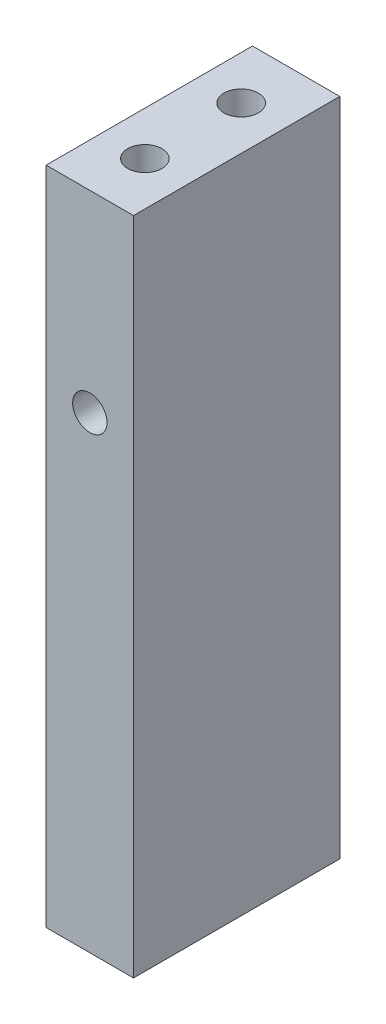
ISO-10303-21;
HEADER;
FILE_DESCRIPTION(('STEP AP214'),'2;1');
FILE_NAME('part.step','',(''),(''),'','','');
FILE_SCHEMA(('AUTOMOTIVE_DESIGN { 1 0 10303 214 1 1 1 1 }'));
ENDSEC;
DATA;
#1=APPLICATION_CONTEXT('core data for automotive mechanical design processes');
#2=APPLICATION_PROTOCOL_DEFINITION('international standard','automotive_design',2000,#1);
#3=PRODUCT_CONTEXT('',#1,'mechanical');
#4=PRODUCT('Part','Part','',(#3));
#5=PRODUCT_RELATED_PRODUCT_CATEGORY('part','',(#4));
#6=PRODUCT_DEFINITION_FORMATION('','',#4);
#7=PRODUCT_DEFINITION_CONTEXT('part definition',#1,'design');
#8=PRODUCT_DEFINITION('design','',#6,#7);
#9=PRODUCT_DEFINITION_SHAPE('','',#8);
#10=(LENGTH_UNIT() NAMED_UNIT(*) SI_UNIT(.MILLI.,.METRE.));
#11=(NAMED_UNIT(*) PLANE_ANGLE_UNIT() SI_UNIT($,.RADIAN.));
#12=(NAMED_UNIT(*) SI_UNIT($,.STERADIAN.) SOLID_ANGLE_UNIT());
#13=UNCERTAINTY_MEASURE_WITH_UNIT(LENGTH_MEASURE(1.E-05),#10,'distance_accuracy_value','');
#14=(GEOMETRIC_REPRESENTATION_CONTEXT(3) GLOBAL_UNCERTAINTY_ASSIGNED_CONTEXT((#13)) GLOBAL_UNIT_ASSIGNED_CONTEXT((#10,
#11,#12)) REPRESENTATION_CONTEXT('',''));
#15=CARTESIAN_POINT('',(0.,0.,0.));
#16=DIRECTION('',(0.,0.,1.));
#17=DIRECTION('',(1.,0.,0.));
#18=AXIS2_PLACEMENT_3D('',#15,#16,#17);
#19=CARTESIAN_POINT('',(0.,0.,15.));
#20=DIRECTION('',(1.,0.,0.));
#21=DIRECTION('',(0.,0.,-1.));
#22=AXIS2_PLACEMENT_3D('',#19,#20,#21);
#23=PLANE('',#22);
#24=DIRECTION('',(0.,-1.,0.));
#25=VECTOR('',#24,1.);
#26=CARTESIAN_POINT('',(0.,0.,0.));
#27=LINE('',#26,#25);
#28=CARTESIAN_POINT('',(0.,48.,0.));
#29=VERTEX_POINT('',#28);
#30=CARTESIAN_POINT('',(0.,0.,0.));
#31=VERTEX_POINT('',#30);
#32=EDGE_CURVE('E145',#29,#31,#27,.T.);
#33=ORIENTED_EDGE('',*,*,#32,.T.);
#34=DIRECTION('',(0.,0.,-1.));
#35=VECTOR('',#34,1.);
#36=CARTESIAN_POINT('',(0.,0.,15.));
#37=LINE('',#36,#35);
#38=CARTESIAN_POINT('',(0.,0.,15.));
#39=VERTEX_POINT('',#38);
#40=EDGE_CURVE('E11',#39,#31,#37,.T.);
#41=ORIENTED_EDGE('',*,*,#40,.F.);
#42=DIRECTION('',(0.,-1.,0.));
#43=VECTOR('',#42,1.);
#44=CARTESIAN_POINT('',(0.,0.,15.));
#45=LINE('',#44,#43);
#46=CARTESIAN_POINT('',(0.,48.,15.));
#47=VERTEX_POINT('',#46);
#48=EDGE_CURVE('E146',#47,#39,#45,.T.);
#49=ORIENTED_EDGE('',*,*,#48,.F.);
#50=DIRECTION('',(0.,0.,-1.));
#51=VECTOR('',#50,1.);
#52=CARTESIAN_POINT('',(0.,48.,15.));
#53=LINE('',#52,#51);
#54=EDGE_CURVE('E152',#47,#29,#53,.T.);
#55=ORIENTED_EDGE('',*,*,#54,.T.);
#56=EDGE_LOOP('',(#33,#41,#49,#55));
#57=FACE_BOUND('',#56,.T.);
#58=ADVANCED_FACE('F43',(#57),#23,.F.);
#59=CARTESIAN_POINT('',(0.,0.,15.));
#60=DIRECTION('',(0.,1.,0.));
#61=DIRECTION('',(0.,0.,1.));
#62=AXIS2_PLACEMENT_3D('',#59,#60,#61);
#63=PLANE('',#62);
#64=CARTESIAN_POINT('',(3.175,0.,11.));
#65=DIRECTION('',(0.,-1.,0.));
#66=DIRECTION('',(0.,0.,-1.));
#67=AXIS2_PLACEMENT_3D('',#64,#65,#66);
#68=CIRCLE('',#67,1.25);
#69=CARTESIAN_POINT('',(3.175,0.,9.75));
#70=VERTEX_POINT('',#69);
#71=EDGE_CURVE('E133',#70,#70,#68,.T.);
#72=ORIENTED_EDGE('',*,*,#71,.F.);
#73=EDGE_LOOP('',(#72));
#74=FACE_BOUND('',#73,.T.);
#75=CARTESIAN_POINT('',(3.175,0.,4.));
#76=DIRECTION('',(0.,-1.,0.));
#77=DIRECTION('',(0.,0.,-1.));
#78=AXIS2_PLACEMENT_3D('',#75,#76,#77);
#79=CIRCLE('',#78,1.25);
#80=CARTESIAN_POINT('',(3.175,0.,2.75));
#81=VERTEX_POINT('',#80);
#82=EDGE_CURVE('E139',#81,#81,#79,.T.);
#83=ORIENTED_EDGE('',*,*,#82,.F.);
#84=EDGE_LOOP('',(#83));
#85=FACE_BOUND('',#84,.T.);
#86=DIRECTION('',(1.,0.,0.));
#87=VECTOR('',#86,1.);
#88=CARTESIAN_POINT('',(0.,0.,0.));
#89=LINE('',#88,#87);
#90=CARTESIAN_POINT('',(6.35,0.,0.));
#91=VERTEX_POINT('',#90);
#92=EDGE_CURVE('E155',#31,#91,#89,.T.);
#93=ORIENTED_EDGE('',*,*,#92,.T.);
#94=DIRECTION('',(0.,0.,-1.));
#95=VECTOR('',#94,1.);
#96=CARTESIAN_POINT('',(6.35,0.,15.));
#97=LINE('',#96,#95);
#98=CARTESIAN_POINT('',(6.35,0.,15.));
#99=VERTEX_POINT('',#98);
#100=EDGE_CURVE('E51',#99,#91,#97,.T.);
#101=ORIENTED_EDGE('',*,*,#100,.F.);
#102=DIRECTION('',(1.,0.,0.));
#103=VECTOR('',#102,1.);
#104=CARTESIAN_POINT('',(0.,0.,15.));
#105=LINE('',#104,#103);
#106=EDGE_CURVE('E90',#39,#99,#105,.T.);
#107=ORIENTED_EDGE('',*,*,#106,.F.);
#108=ORIENTED_EDGE('',*,*,#40,.T.);
#109=EDGE_LOOP('',(#93,#101,#107,#108));
#110=FACE_BOUND('',#109,.T.);
#111=ADVANCED_FACE('F180',(#74,#85,#110),#63,.F.);
#112=CARTESIAN_POINT('',(6.35,0.,15.));
#113=DIRECTION('',(-1.,0.,0.));
#114=DIRECTION('',(0.,-1.,0.));
#115=AXIS2_PLACEMENT_3D('',#112,#113,#114);
#116=PLANE('',#115);
#117=DIRECTION('',(0.,1.,0.));
#118=VECTOR('',#117,1.);
#119=CARTESIAN_POINT('',(6.35,0.,0.));
#120=LINE('',#119,#118);
#121=CARTESIAN_POINT('',(6.35,48.,0.));
#122=VERTEX_POINT('',#121);
#123=EDGE_CURVE('E77',#91,#122,#120,.T.);
#124=ORIENTED_EDGE('',*,*,#123,.T.);
#125=DIRECTION('',(0.,0.,-1.));
#126=VECTOR('',#125,1.);
#127=CARTESIAN_POINT('',(6.35,48.,15.));
#128=LINE('',#127,#126);
#129=CARTESIAN_POINT('',(6.35,48.,15.));
#130=VERTEX_POINT('',#129);
#131=EDGE_CURVE('E160',#130,#122,#128,.T.);
#132=ORIENTED_EDGE('',*,*,#131,.F.);
#133=DIRECTION('',(0.,1.,0.));
#134=VECTOR('',#133,1.);
#135=CARTESIAN_POINT('',(6.35,0.,15.));
#136=LINE('',#135,#134);
#137=EDGE_CURVE('E149',#99,#130,#136,.T.);
#138=ORIENTED_EDGE('',*,*,#137,.F.);
#139=ORIENTED_EDGE('',*,*,#100,.T.);
#140=EDGE_LOOP('',(#124,#132,#138,#139));
#141=FACE_BOUND('',#140,.T.);
#142=ADVANCED_FACE('F162',(#141),#116,.F.);
#143=CARTESIAN_POINT('',(0.,48.,15.));
#144=DIRECTION('',(0.,-1.,0.));
#145=DIRECTION('',(0.,0.,-1.));
#146=AXIS2_PLACEMENT_3D('',#143,#144,#145);
#147=PLANE('',#146);
#148=CARTESIAN_POINT('',(3.175,48.,4.));
#149=DIRECTION('',(0.,1.,0.));
#150=DIRECTION('',(0.,0.,1.));
#151=AXIS2_PLACEMENT_3D('',#148,#149,#150);
#152=CIRCLE('',#151,1.25);
#153=CARTESIAN_POINT('',(3.175,48.,5.25));
#154=VERTEX_POINT('',#153);
#155=EDGE_CURVE('E116',#154,#154,#152,.T.);
#156=ORIENTED_EDGE('',*,*,#155,.F.);
#157=EDGE_LOOP('',(#156));
#158=FACE_BOUND('',#157,.T.);
#159=CARTESIAN_POINT('',(3.175,48.,11.));
#160=DIRECTION('',(0.,1.,0.));
#161=DIRECTION('',(0.,0.,1.));
#162=AXIS2_PLACEMENT_3D('',#159,#160,#161);
#163=CIRCLE('',#162,1.25);
#164=CARTESIAN_POINT('',(3.175,48.,12.25));
#165=VERTEX_POINT('',#164);
#166=EDGE_CURVE('E127',#165,#165,#163,.T.);
#167=ORIENTED_EDGE('',*,*,#166,.F.);
#168=EDGE_LOOP('',(#167));
#169=FACE_BOUND('',#168,.T.);
#170=DIRECTION('',(-1.,0.,0.));
#171=VECTOR('',#170,1.);
#172=CARTESIAN_POINT('',(0.,48.,0.));
#173=LINE('',#172,#171);
#174=EDGE_CURVE('E83',#122,#29,#173,.T.);
#175=ORIENTED_EDGE('',*,*,#174,.T.);
#176=ORIENTED_EDGE('',*,*,#54,.F.);
#177=DIRECTION('',(-1.,0.,0.));
#178=VECTOR('',#177,1.);
#179=CARTESIAN_POINT('',(0.,48.,15.));
#180=LINE('',#179,#178);
#181=EDGE_CURVE('E59',#130,#47,#180,.T.);
#182=ORIENTED_EDGE('',*,*,#181,.F.);
#183=ORIENTED_EDGE('',*,*,#131,.T.);
#184=EDGE_LOOP('',(#175,#176,#182,#183));
#185=FACE_BOUND('',#184,.T.);
#186=ADVANCED_FACE('F169',(#158,#169,#185),#147,.F.);
#187=CARTESIAN_POINT('',(0.,0.,15.));
#188=DIRECTION('',(0.,0.,-1.));
#189=DIRECTION('',(-1.,0.,0.));
#190=AXIS2_PLACEMENT_3D('',#187,#188,#189);
#191=PLANE('',#190);
#192=CARTESIAN_POINT('',(3.175,34.,15.));
#193=DIRECTION('',(0.,0.,1.));
#194=DIRECTION('',(1.,0.,0.));
#195=AXIS2_PLACEMENT_3D('',#192,#193,#194);
#196=CIRCLE('',#195,1.25);
#197=CARTESIAN_POINT('',(4.42499999999999,34.,15.));
#198=VERTEX_POINT('',#197);
#199=EDGE_CURVE('E117',#198,#198,#196,.T.);
#200=ORIENTED_EDGE('',*,*,#199,.F.);
#201=EDGE_LOOP('',(#200));
#202=FACE_BOUND('',#201,.T.);
#203=ORIENTED_EDGE('',*,*,#48,.T.);
#204=ORIENTED_EDGE('',*,*,#106,.T.);
#205=ORIENTED_EDGE('',*,*,#137,.T.);
#206=ORIENTED_EDGE('',*,*,#181,.T.);
#207=EDGE_LOOP('',(#203,#204,#205,#206));
#208=FACE_BOUND('',#207,.T.);
#209=ADVANCED_FACE('F171',(#202,#208),#191,.F.);
#210=CARTESIAN_POINT('',(0.,0.,0.));
#211=DIRECTION('',(0.,0.,-1.));
#212=DIRECTION('',(-1.,0.,0.));
#213=AXIS2_PLACEMENT_3D('',#210,#211,#212);
#214=PLANE('',#213);
#215=ORIENTED_EDGE('',*,*,#32,.F.);
#216=ORIENTED_EDGE('',*,*,#174,.F.);
#217=ORIENTED_EDGE('',*,*,#123,.F.);
#218=ORIENTED_EDGE('',*,*,#92,.F.);
#219=EDGE_LOOP('',(#215,#216,#217,#218));
#220=FACE_BOUND('',#219,.T.);
#221=ADVANCED_FACE('F165',(#220),#214,.T.);
#222=CARTESIAN_POINT('',(3.175,10.,4.));
#223=DIRECTION('',(0.,-1.,0.));
#224=DIRECTION('',(0.,0.,-1.));
#225=AXIS2_PLACEMENT_3D('',#222,#223,#224);
#226=CONICAL_SURFACE('',#225,1.25,1.02974425867665);
#227=CARTESIAN_POINT('',(3.175,10.7510757737845,4.));
#228=VERTEX_POINT('',#227);
#229=VERTEX_LOOP('',#228);
#230=FACE_BOUND('',#229,.T.);
#231=CARTESIAN_POINT('',(3.175,10.,4.));
#232=DIRECTION('',(0.,-1.,0.));
#233=DIRECTION('',(0.,0.,-1.));
#234=AXIS2_PLACEMENT_3D('',#231,#232,#233);
#235=CIRCLE('',#234,1.25);
#236=CARTESIAN_POINT('',(3.175,10.,2.75));
#237=VERTEX_POINT('',#236);
#238=EDGE_CURVE('E142',#237,#237,#235,.T.);
#239=ORIENTED_EDGE('',*,*,#238,.T.);
#240=EDGE_LOOP('',(#239));
#241=FACE_BOUND('',#240,.T.);
#242=ADVANCED_FACE('F199',(#230,#241),#226,.F.);
#243=CARTESIAN_POINT('',(3.175,0.,4.));
#244=DIRECTION('',(0.,-1.,0.));
#245=DIRECTION('',(0.,0.,-1.));
#246=AXIS2_PLACEMENT_3D('',#243,#244,#245);
#247=CYLINDRICAL_SURFACE('',#246,1.25);
#248=ORIENTED_EDGE('',*,*,#238,.F.);
#249=EDGE_LOOP('',(#248));
#250=FACE_BOUND('',#249,.T.);
#251=ORIENTED_EDGE('',*,*,#82,.T.);
#252=EDGE_LOOP('',(#251));
#253=FACE_BOUND('',#252,.T.);
#254=ADVANCED_FACE('F196',(#250,#253),#247,.F.);
#255=CARTESIAN_POINT('',(3.175,10.,11.));
#256=DIRECTION('',(0.,-1.,0.));
#257=DIRECTION('',(0.,0.,-1.));
#258=AXIS2_PLACEMENT_3D('',#255,#256,#257);
#259=CONICAL_SURFACE('',#258,1.25,1.02974425867665);
#260=CARTESIAN_POINT('',(3.175,10.7510757737845,11.));
#261=VERTEX_POINT('',#260);
#262=VERTEX_LOOP('',#261);
#263=FACE_BOUND('',#262,.T.);
#264=CARTESIAN_POINT('',(3.175,10.,11.));
#265=DIRECTION('',(0.,-1.,0.));
#266=DIRECTION('',(0.,0.,-1.));
#267=AXIS2_PLACEMENT_3D('',#264,#265,#266);
#268=CIRCLE('',#267,1.25);
#269=CARTESIAN_POINT('',(3.175,10.,9.75));
#270=VERTEX_POINT('',#269);
#271=EDGE_CURVE('E136',#270,#270,#268,.T.);
#272=ORIENTED_EDGE('',*,*,#271,.T.);
#273=EDGE_LOOP('',(#272));
#274=FACE_BOUND('',#273,.T.);
#275=ADVANCED_FACE('F198',(#263,#274),#259,.F.);
#276=CARTESIAN_POINT('',(3.175,0.,11.));
#277=DIRECTION('',(0.,-1.,0.));
#278=DIRECTION('',(0.,0.,-1.));
#279=AXIS2_PLACEMENT_3D('',#276,#277,#278);
#280=CYLINDRICAL_SURFACE('',#279,1.25);
#281=ORIENTED_EDGE('',*,*,#271,.F.);
#282=EDGE_LOOP('',(#281));
#283=FACE_BOUND('',#282,.T.);
#284=ORIENTED_EDGE('',*,*,#71,.T.);
#285=EDGE_LOOP('',(#284));
#286=FACE_BOUND('',#285,.T.);
#287=ADVANCED_FACE('F206',(#283,#286),#280,.F.);
#288=CARTESIAN_POINT('',(3.175,38.,11.));
#289=DIRECTION('',(0.,1.,0.));
#290=DIRECTION('',(0.,0.,1.));
#291=AXIS2_PLACEMENT_3D('',#288,#289,#290);
#292=CONICAL_SURFACE('',#291,1.25,1.02974425867665);
#293=CARTESIAN_POINT('',(3.175,37.2489242262155,11.));
#294=VERTEX_POINT('',#293);
#295=VERTEX_LOOP('',#294);
#296=FACE_BOUND('',#295,.T.);
#297=CARTESIAN_POINT('',(3.175,38.,11.));
#298=DIRECTION('',(0.,1.,0.));
#299=DIRECTION('',(0.,0.,1.));
#300=AXIS2_PLACEMENT_3D('',#297,#298,#299);
#301=CIRCLE('',#300,1.25);
#302=CARTESIAN_POINT('',(3.175,38.,12.25));
#303=VERTEX_POINT('',#302);
#304=EDGE_CURVE('E130',#303,#303,#301,.T.);
#305=ORIENTED_EDGE('',*,*,#304,.T.);
#306=EDGE_LOOP('',(#305));
#307=FACE_BOUND('',#306,.T.);
#308=ADVANCED_FACE('F251',(#296,#307),#292,.F.);
#309=CARTESIAN_POINT('',(3.175,48.,11.));
#310=DIRECTION('',(0.,1.,0.));
#311=DIRECTION('',(0.,0.,1.));
#312=AXIS2_PLACEMENT_3D('',#309,#310,#311);
#313=CYLINDRICAL_SURFACE('',#312,1.25);
#314=ORIENTED_EDGE('',*,*,#304,.F.);
#315=EDGE_LOOP('',(#314));
#316=FACE_BOUND('',#315,.T.);
#317=ORIENTED_EDGE('',*,*,#166,.T.);
#318=EDGE_LOOP('',(#317));
#319=FACE_BOUND('',#318,.T.);
#320=ADVANCED_FACE('F273',(#316,#319),#313,.F.);
#321=CARTESIAN_POINT('',(3.175,38.,4.));
#322=DIRECTION('',(0.,1.,0.));
#323=DIRECTION('',(0.,0.,1.));
#324=AXIS2_PLACEMENT_3D('',#321,#322,#323);
#325=CONICAL_SURFACE('',#324,1.25,1.02974425867665);
#326=CARTESIAN_POINT('',(3.175,37.2489242262155,4.));
#327=VERTEX_POINT('',#326);
#328=VERTEX_LOOP('',#327);
#329=FACE_BOUND('',#328,.T.);
#330=CARTESIAN_POINT('',(3.175,38.,4.));
#331=DIRECTION('',(0.,1.,0.));
#332=DIRECTION('',(0.,0.,1.));
#333=AXIS2_PLACEMENT_3D('',#330,#331,#332);
#334=CIRCLE('',#333,1.25);
#335=CARTESIAN_POINT('',(3.175,38.,5.25));
#336=VERTEX_POINT('',#335);
#337=EDGE_CURVE('E120',#336,#336,#334,.T.);
#338=ORIENTED_EDGE('',*,*,#337,.T.);
#339=EDGE_LOOP('',(#338));
#340=FACE_BOUND('',#339,.T.);
#341=ADVANCED_FACE('F283',(#329,#340),#325,.F.);
#342=CARTESIAN_POINT('',(3.175,48.,4.));
#343=DIRECTION('',(0.,1.,0.));
#344=DIRECTION('',(0.,0.,1.));
#345=AXIS2_PLACEMENT_3D('',#342,#343,#344);
#346=CYLINDRICAL_SURFACE('',#345,1.25);
#347=ORIENTED_EDGE('',*,*,#337,.F.);
#348=EDGE_LOOP('',(#347));
#349=FACE_BOUND('',#348,.T.);
#350=ORIENTED_EDGE('',*,*,#155,.T.);
#351=EDGE_LOOP('',(#350));
#352=FACE_BOUND('',#351,.T.);
#353=ADVANCED_FACE('F110',(#349,#352),#346,.F.);
#354=CARTESIAN_POINT('',(3.175,34.,5.));
#355=DIRECTION('',(0.,0.,1.));
#356=DIRECTION('',(1.,0.,0.));
#357=AXIS2_PLACEMENT_3D('',#354,#355,#356);
#358=CONICAL_SURFACE('',#357,1.25,1.02974425867665);
#359=CARTESIAN_POINT('',(3.17499999999999,34.,4.24892422621555));
#360=VERTEX_POINT('',#359);
#361=VERTEX_LOOP('',#360);
#362=FACE_BOUND('',#361,.T.);
#363=CARTESIAN_POINT('',(3.175,34.,5.));
#364=DIRECTION('',(0.,0.,1.));
#365=DIRECTION('',(1.,0.,0.));
#366=AXIS2_PLACEMENT_3D('',#363,#364,#365);
#367=CIRCLE('',#366,1.25);
#368=CARTESIAN_POINT('',(4.42499999999999,34.,5.));
#369=VERTEX_POINT('',#368);
#370=EDGE_CURVE('E114',#369,#369,#367,.T.);
#371=ORIENTED_EDGE('',*,*,#370,.T.);
#372=EDGE_LOOP('',(#371));
#373=FACE_BOUND('',#372,.T.);
#374=ADVANCED_FACE('F106',(#362,#373),#358,.F.);
#375=CARTESIAN_POINT('',(3.175,34.,15.));
#376=DIRECTION('',(0.,0.,1.));
#377=DIRECTION('',(1.,0.,0.));
#378=AXIS2_PLACEMENT_3D('',#375,#376,#377);
#379=CYLINDRICAL_SURFACE('',#378,1.25);
#380=ORIENTED_EDGE('',*,*,#370,.F.);
#381=EDGE_LOOP('',(#380));
#382=FACE_BOUND('',#381,.T.);
#383=ORIENTED_EDGE('',*,*,#199,.T.);
#384=EDGE_LOOP('',(#383));
#385=FACE_BOUND('',#384,.T.);
#386=ADVANCED_FACE('F109',(#382,#385),#379,.F.);
#387=CLOSED_SHELL('',(#58,#111,#142,#186,#209,#221,#242,#254,#275,#287,#308,#320,#341,#353,#374,#386));
#388=MANIFOLD_SOLID_BREP('B2',#387);
#389=ADVANCED_BREP_SHAPE_REPRESENTATION('',(#18,#388),#14);
#390=SHAPE_DEFINITION_REPRESENTATION(#9,#389);
ENDSEC;
END-ISO-10303-21;
